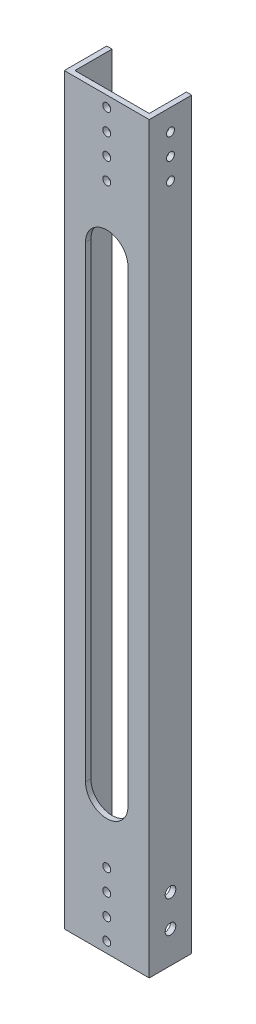
ISO-10303-21;
HEADER;
FILE_DESCRIPTION(('STEP AP214'),'2;1');
FILE_NAME('part.step','',(''),(''),'','','');
FILE_SCHEMA(('AUTOMOTIVE_DESIGN { 1 0 10303 214 1 1 1 1 }'));
ENDSEC;
DATA;
#1=APPLICATION_CONTEXT('core data for automotive mechanical design processes');
#2=APPLICATION_PROTOCOL_DEFINITION('international standard','automotive_design',2000,#1);
#3=PRODUCT_CONTEXT('',#1,'mechanical');
#4=PRODUCT('Part','Part','',(#3));
#5=PRODUCT_RELATED_PRODUCT_CATEGORY('part','',(#4));
#6=PRODUCT_DEFINITION_FORMATION('','',#4);
#7=PRODUCT_DEFINITION_CONTEXT('part definition',#1,'design');
#8=PRODUCT_DEFINITION('design','',#6,#7);
#9=PRODUCT_DEFINITION_SHAPE('','',#8);
#10=(LENGTH_UNIT() NAMED_UNIT(*) SI_UNIT(.MILLI.,.METRE.));
#11=(NAMED_UNIT(*) PLANE_ANGLE_UNIT() SI_UNIT($,.RADIAN.));
#12=(NAMED_UNIT(*) SI_UNIT($,.STERADIAN.) SOLID_ANGLE_UNIT());
#13=UNCERTAINTY_MEASURE_WITH_UNIT(LENGTH_MEASURE(1.E-05),#10,'distance_accuracy_value','');
#14=(GEOMETRIC_REPRESENTATION_CONTEXT(3) GLOBAL_UNCERTAINTY_ASSIGNED_CONTEXT((#13)) GLOBAL_UNIT_ASSIGNED_CONTEXT((#10,
#11,#12)) REPRESENTATION_CONTEXT('',''));
#15=CARTESIAN_POINT('',(0.,0.,0.));
#16=DIRECTION('',(0.,0.,1.));
#17=DIRECTION('',(1.,0.,0.));
#18=AXIS2_PLACEMENT_3D('',#15,#16,#17);
#19=CARTESIAN_POINT('',(0.,444.5,0.));
#20=DIRECTION('',(0.,0.,-1.));
#21=DIRECTION('',(-1.,0.,0.));
#22=AXIS2_PLACEMENT_3D('',#19,#20,#21);
#23=PLANE('',#22);
#24=CARTESIAN_POINT('',(25.4,44.45,0.));
#25=DIRECTION('',(0.,0.,1.));
#26=DIRECTION('',(1.,0.,0.));
#27=AXIS2_PLACEMENT_3D('',#24,#25,#26);
#28=CIRCLE('',#27,2.38124999999999);
#29=CARTESIAN_POINT('',(27.78125,44.45,0.));
#30=VERTEX_POINT('',#29);
#31=EDGE_CURVE('E663',#30,#30,#28,.T.);
#32=ORIENTED_EDGE('',*,*,#31,.F.);
#33=EDGE_LOOP('',(#32));
#34=FACE_BOUND('',#33,.T.);
#35=CARTESIAN_POINT('',(25.4,425.45,0.));
#36=DIRECTION('',(0.,0.,1.));
#37=DIRECTION('',(1.,0.,0.));
#38=AXIS2_PLACEMENT_3D('',#35,#36,#37);
#39=CIRCLE('',#38,2.38125000000002);
#40=CARTESIAN_POINT('',(27.78125,425.45,0.));
#41=VERTEX_POINT('',#40);
#42=EDGE_CURVE('E179',#41,#41,#39,.T.);
#43=ORIENTED_EDGE('',*,*,#42,.F.);
#44=EDGE_LOOP('',(#43));
#45=FACE_BOUND('',#44,.T.);
#46=CARTESIAN_POINT('',(25.4,412.75,0.));
#47=DIRECTION('',(0.,0.,1.));
#48=DIRECTION('',(1.,0.,0.));
#49=AXIS2_PLACEMENT_3D('',#46,#47,#48);
#50=CIRCLE('',#49,2.38125000000002);
#51=CARTESIAN_POINT('',(27.78125,412.75,0.));
#52=VERTEX_POINT('',#51);
#53=EDGE_CURVE('E242',#52,#52,#50,.T.);
#54=ORIENTED_EDGE('',*,*,#53,.F.);
#55=EDGE_LOOP('',(#54));
#56=FACE_BOUND('',#55,.T.);
#57=CARTESIAN_POINT('',(25.4,400.05,0.));
#58=DIRECTION('',(0.,0.,1.));
#59=DIRECTION('',(1.,0.,0.));
#60=AXIS2_PLACEMENT_3D('',#57,#58,#59);
#61=CIRCLE('',#60,2.38125000000002);
#62=CARTESIAN_POINT('',(27.78125,400.05,0.));
#63=VERTEX_POINT('',#62);
#64=EDGE_CURVE('E239',#63,#63,#61,.T.);
#65=ORIENTED_EDGE('',*,*,#64,.F.);
#66=EDGE_LOOP('',(#65));
#67=FACE_BOUND('',#66,.T.);
#68=CARTESIAN_POINT('',(25.4,438.15,0.));
#69=DIRECTION('',(0.,0.,1.));
#70=DIRECTION('',(1.,0.,0.));
#71=AXIS2_PLACEMENT_3D('',#68,#69,#70);
#72=CIRCLE('',#71,2.38125000000002);
#73=CARTESIAN_POINT('',(27.78125,438.15,0.));
#74=VERTEX_POINT('',#73);
#75=EDGE_CURVE('E175',#74,#74,#72,.T.);
#76=ORIENTED_EDGE('',*,*,#75,.F.);
#77=EDGE_LOOP('',(#76));
#78=FACE_BOUND('',#77,.T.);
#79=DIRECTION('',(0.,1.,0.));
#80=VECTOR('',#79,1.);
#81=CARTESIAN_POINT('',(50.8,444.5,0.));
#82=LINE('',#81,#80);
#83=CARTESIAN_POINT('',(50.8,444.5,0.));
#84=VERTEX_POINT('',#83);
#85=CARTESIAN_POINT('',(50.8,0.,0.));
#86=VERTEX_POINT('',#85);
#87=EDGE_CURVE('E49',#84,#86,#82,.F.);
#88=ORIENTED_EDGE('',*,*,#87,.F.);
#89=DIRECTION('',(-1.,0.,0.));
#90=VECTOR('',#89,1.);
#91=CARTESIAN_POINT('',(0.,444.5,0.));
#92=LINE('',#91,#90);
#93=CARTESIAN_POINT('',(0.,444.5,0.));
#94=VERTEX_POINT('',#93);
#95=EDGE_CURVE('E169',#94,#84,#92,.F.);
#96=ORIENTED_EDGE('',*,*,#95,.F.);
#97=DIRECTION('',(0.,1.,0.));
#98=VECTOR('',#97,1.);
#99=CARTESIAN_POINT('',(0.,444.5,0.));
#100=LINE('',#99,#98);
#101=CARTESIAN_POINT('',(0.,0.,0.));
#102=VERTEX_POINT('',#101);
#103=EDGE_CURVE('E172',#102,#94,#100,.T.);
#104=ORIENTED_EDGE('',*,*,#103,.F.);
#105=DIRECTION('',(-1.,0.,0.));
#106=VECTOR('',#105,1.);
#107=CARTESIAN_POINT('',(0.,0.,0.));
#108=LINE('',#107,#106);
#109=EDGE_CURVE('E11',#86,#102,#108,.T.);
#110=ORIENTED_EDGE('',*,*,#109,.F.);
#111=EDGE_LOOP('',(#88,#96,#104,#110));
#112=FACE_BOUND('',#111,.T.);
#113=DIRECTION('',(0.,-1.,0.));
#114=VECTOR('',#113,1.);
#115=CARTESIAN_POINT('',(12.7,361.95,0.));
#116=LINE('',#115,#114);
#117=CARTESIAN_POINT('',(12.7,361.95,0.));
#118=VERTEX_POINT('',#117);
#119=CARTESIAN_POINT('',(12.7,82.55,0.));
#120=VERTEX_POINT('',#119);
#121=EDGE_CURVE('E152',#118,#120,#116,.T.);
#122=ORIENTED_EDGE('',*,*,#121,.F.);
#123=CARTESIAN_POINT('',(25.4,361.95,0.));
#124=DIRECTION('',(0.,0.,1.));
#125=DIRECTION('',(1.,0.,0.));
#126=AXIS2_PLACEMENT_3D('',#123,#124,#125);
#127=CIRCLE('',#126,12.7);
#128=CARTESIAN_POINT('',(38.1,361.95,0.));
#129=VERTEX_POINT('',#128);
#130=EDGE_CURVE('E65',#129,#118,#127,.T.);
#131=ORIENTED_EDGE('',*,*,#130,.F.);
#132=DIRECTION('',(0.,1.,0.));
#133=VECTOR('',#132,1.);
#134=CARTESIAN_POINT('',(38.1,361.95,0.));
#135=LINE('',#134,#133);
#136=CARTESIAN_POINT('',(38.1,82.55,0.));
#137=VERTEX_POINT('',#136);
#138=EDGE_CURVE('E139',#137,#129,#135,.T.);
#139=ORIENTED_EDGE('',*,*,#138,.F.);
#140=CARTESIAN_POINT('',(25.4,82.55,0.));
#141=DIRECTION('',(0.,0.,1.));
#142=DIRECTION('',(1.,0.,0.));
#143=AXIS2_PLACEMENT_3D('',#140,#141,#142);
#144=CIRCLE('',#143,12.7);
#145=EDGE_CURVE('E158',#120,#137,#144,.T.);
#146=ORIENTED_EDGE('',*,*,#145,.F.);
#147=EDGE_LOOP('',(#122,#131,#139,#146));
#148=FACE_BOUND('',#147,.T.);
#149=CARTESIAN_POINT('',(25.4,6.35,0.));
#150=DIRECTION('',(0.,0.,1.));
#151=DIRECTION('',(1.,0.,0.));
#152=AXIS2_PLACEMENT_3D('',#149,#150,#151);
#153=CIRCLE('',#152,2.38124999999999);
#154=CARTESIAN_POINT('',(27.78125,6.35,0.));
#155=VERTEX_POINT('',#154);
#156=EDGE_CURVE('E679',#155,#155,#153,.T.);
#157=ORIENTED_EDGE('',*,*,#156,.F.);
#158=EDGE_LOOP('',(#157));
#159=FACE_BOUND('',#158,.T.);
#160=CARTESIAN_POINT('',(25.4,19.05,0.));
#161=DIRECTION('',(0.,0.,1.));
#162=DIRECTION('',(1.,0.,0.));
#163=AXIS2_PLACEMENT_3D('',#160,#161,#162);
#164=CIRCLE('',#163,2.38124999999999);
#165=CARTESIAN_POINT('',(27.78125,19.05,0.));
#166=VERTEX_POINT('',#165);
#167=EDGE_CURVE('E673',#166,#166,#164,.T.);
#168=ORIENTED_EDGE('',*,*,#167,.F.);
#169=EDGE_LOOP('',(#168));
#170=FACE_BOUND('',#169,.T.);
#171=CARTESIAN_POINT('',(25.4,31.75,0.));
#172=DIRECTION('',(0.,0.,1.));
#173=DIRECTION('',(1.,0.,0.));
#174=AXIS2_PLACEMENT_3D('',#171,#172,#173);
#175=CIRCLE('',#174,2.38124999999999);
#176=CARTESIAN_POINT('',(27.78125,31.75,0.));
#177=VERTEX_POINT('',#176);
#178=EDGE_CURVE('E665',#177,#177,#175,.T.);
#179=ORIENTED_EDGE('',*,*,#178,.F.);
#180=EDGE_LOOP('',(#179));
#181=FACE_BOUND('',#180,.T.);
#182=ADVANCED_FACE('F40',(#34,#45,#56,#67,#78,#112,#148,#159,#170,#181),#23,.F.);
#183=CARTESIAN_POINT('',(0.,431.8,-12.7));
#184=DIRECTION('',(1.,0.,0.));
#185=DIRECTION('',(0.,0.,-1.));
#186=AXIS2_PLACEMENT_3D('',#183,#184,#185);
#187=CYLINDRICAL_SURFACE('',#186,2.38125000000006);
#188=CARTESIAN_POINT('',(0.,431.8,-12.7));
#189=DIRECTION('',(1.,0.,0.));
#190=DIRECTION('',(0.,0.,-1.));
#191=AXIS2_PLACEMENT_3D('',#188,#189,#190);
#192=CIRCLE('',#191,2.38125000000006);
#193=CARTESIAN_POINT('',(0.,431.8,-15.0812500000001));
#194=VERTEX_POINT('',#193);
#195=EDGE_CURVE('E271',#194,#194,#192,.F.);
#196=ORIENTED_EDGE('',*,*,#195,.T.);
#197=EDGE_LOOP('',(#196));
#198=FACE_BOUND('',#197,.T.);
#199=CARTESIAN_POINT('',(3.175,431.8,-12.7));
#200=DIRECTION('',(1.,0.,0.));
#201=DIRECTION('',(0.,0.,-1.));
#202=AXIS2_PLACEMENT_3D('',#199,#200,#201);
#203=CIRCLE('',#202,2.38125000000006);
#204=CARTESIAN_POINT('',(3.175,431.8,-15.0812500000001));
#205=VERTEX_POINT('',#204);
#206=EDGE_CURVE('E232',#205,#205,#203,.T.);
#207=ORIENTED_EDGE('',*,*,#206,.T.);
#208=EDGE_LOOP('',(#207));
#209=FACE_BOUND('',#208,.T.);
#210=ADVANCED_FACE('F42',(#198,#209),#187,.F.);
#211=CARTESIAN_POINT('',(0.,406.4,-12.7));
#212=DIRECTION('',(1.,0.,0.));
#213=DIRECTION('',(0.,0.,-1.));
#214=AXIS2_PLACEMENT_3D('',#211,#212,#213);
#215=CYLINDRICAL_SURFACE('',#214,2.38125000000006);
#216=CARTESIAN_POINT('',(0.,406.4,-12.7));
#217=DIRECTION('',(1.,0.,0.));
#218=DIRECTION('',(0.,0.,-1.));
#219=AXIS2_PLACEMENT_3D('',#216,#217,#218);
#220=CIRCLE('',#219,2.38125000000006);
#221=CARTESIAN_POINT('',(0.,406.4,-15.0812500000001));
#222=VERTEX_POINT('',#221);
#223=EDGE_CURVE('E268',#222,#222,#220,.F.);
#224=ORIENTED_EDGE('',*,*,#223,.T.);
#225=EDGE_LOOP('',(#224));
#226=FACE_BOUND('',#225,.T.);
#227=CARTESIAN_POINT('',(3.175,406.4,-12.7));
#228=DIRECTION('',(1.,0.,0.));
#229=DIRECTION('',(0.,0.,-1.));
#230=AXIS2_PLACEMENT_3D('',#227,#228,#229);
#231=CIRCLE('',#230,2.38125000000006);
#232=CARTESIAN_POINT('',(3.175,406.4,-15.0812500000001));
#233=VERTEX_POINT('',#232);
#234=EDGE_CURVE('E293',#233,#233,#231,.T.);
#235=ORIENTED_EDGE('',*,*,#234,.T.);
#236=EDGE_LOOP('',(#235));
#237=FACE_BOUND('',#236,.T.);
#238=ADVANCED_FACE('F338',(#226,#237),#215,.F.);
#239=CARTESIAN_POINT('',(0.,419.1,-12.7));
#240=DIRECTION('',(1.,0.,0.));
#241=DIRECTION('',(0.,0.,-1.));
#242=AXIS2_PLACEMENT_3D('',#239,#240,#241);
#243=CYLINDRICAL_SURFACE('',#242,2.38125000000006);
#244=CARTESIAN_POINT('',(0.,419.1,-12.7));
#245=DIRECTION('',(1.,0.,0.));
#246=DIRECTION('',(0.,0.,-1.));
#247=AXIS2_PLACEMENT_3D('',#244,#245,#246);
#248=CIRCLE('',#247,2.38125000000006);
#249=CARTESIAN_POINT('',(0.,419.1,-15.0812500000001));
#250=VERTEX_POINT('',#249);
#251=EDGE_CURVE('E265',#250,#250,#248,.F.);
#252=ORIENTED_EDGE('',*,*,#251,.T.);
#253=EDGE_LOOP('',(#252));
#254=FACE_BOUND('',#253,.T.);
#255=CARTESIAN_POINT('',(3.175,419.1,-12.7));
#256=DIRECTION('',(1.,0.,0.));
#257=DIRECTION('',(0.,0.,-1.));
#258=AXIS2_PLACEMENT_3D('',#255,#256,#257);
#259=CIRCLE('',#258,2.38125000000006);
#260=CARTESIAN_POINT('',(3.175,419.1,-15.0812500000001));
#261=VERTEX_POINT('',#260);
#262=EDGE_CURVE('E290',#261,#261,#259,.T.);
#263=ORIENTED_EDGE('',*,*,#262,.T.);
#264=EDGE_LOOP('',(#263));
#265=FACE_BOUND('',#264,.T.);
#266=ADVANCED_FACE('F403',(#254,#265),#243,.F.);
#267=CARTESIAN_POINT('',(0.,19.05,-12.7));
#268=DIRECTION('',(1.,0.,0.));
#269=DIRECTION('',(0.,0.,-1.));
#270=AXIS2_PLACEMENT_3D('',#267,#268,#269);
#271=CYLINDRICAL_SURFACE('',#270,3.17500000000001);
#272=CARTESIAN_POINT('',(0.,19.05,-12.7));
#273=DIRECTION('',(1.,0.,0.));
#274=DIRECTION('',(0.,0.,-1.));
#275=AXIS2_PLACEMENT_3D('',#272,#273,#274);
#276=CIRCLE('',#275,3.17500000000001);
#277=CARTESIAN_POINT('',(0.,19.05,-15.875));
#278=VERTEX_POINT('',#277);
#279=EDGE_CURVE('E262',#278,#278,#276,.F.);
#280=ORIENTED_EDGE('',*,*,#279,.T.);
#281=EDGE_LOOP('',(#280));
#282=FACE_BOUND('',#281,.T.);
#283=CARTESIAN_POINT('',(3.175,19.05,-12.7));
#284=DIRECTION('',(1.,0.,0.));
#285=DIRECTION('',(0.,0.,-1.));
#286=AXIS2_PLACEMENT_3D('',#283,#284,#285);
#287=CIRCLE('',#286,3.17500000000001);
#288=CARTESIAN_POINT('',(3.175,19.05,-15.875));
#289=VERTEX_POINT('',#288);
#290=EDGE_CURVE('E287',#289,#289,#287,.T.);
#291=ORIENTED_EDGE('',*,*,#290,.T.);
#292=EDGE_LOOP('',(#291));
#293=FACE_BOUND('',#292,.T.);
#294=ADVANCED_FACE('F408',(#282,#293),#271,.F.);
#295=CARTESIAN_POINT('',(0.,38.1,-12.7));
#296=DIRECTION('',(1.,0.,0.));
#297=DIRECTION('',(0.,0.,-1.));
#298=AXIS2_PLACEMENT_3D('',#295,#296,#297);
#299=CYLINDRICAL_SURFACE('',#298,3.175);
#300=CARTESIAN_POINT('',(0.,38.1,-12.7));
#301=DIRECTION('',(1.,0.,0.));
#302=DIRECTION('',(0.,0.,-1.));
#303=AXIS2_PLACEMENT_3D('',#300,#301,#302);
#304=CIRCLE('',#303,3.175);
#305=CARTESIAN_POINT('',(0.,38.1,-15.875));
#306=VERTEX_POINT('',#305);
#307=EDGE_CURVE('E220',#306,#306,#304,.F.);
#308=ORIENTED_EDGE('',*,*,#307,.T.);
#309=EDGE_LOOP('',(#308));
#310=FACE_BOUND('',#309,.T.);
#311=CARTESIAN_POINT('',(3.175,38.1,-12.7));
#312=DIRECTION('',(1.,0.,0.));
#313=DIRECTION('',(0.,0.,-1.));
#314=AXIS2_PLACEMENT_3D('',#311,#312,#313);
#315=CIRCLE('',#314,3.175);
#316=CARTESIAN_POINT('',(3.175,38.1,-15.875));
#317=VERTEX_POINT('',#316);
#318=EDGE_CURVE('E228',#317,#317,#315,.T.);
#319=ORIENTED_EDGE('',*,*,#318,.T.);
#320=EDGE_LOOP('',(#319));
#321=FACE_BOUND('',#320,.T.);
#322=ADVANCED_FACE('F414',(#310,#321),#299,.F.);
#323=CARTESIAN_POINT('',(0.,431.8,-12.7));
#324=DIRECTION('',(1.,0.,0.));
#325=DIRECTION('',(0.,0.,-1.));
#326=AXIS2_PLACEMENT_3D('',#323,#324,#325);
#327=CYLINDRICAL_SURFACE('',#326,2.38125000000006);
#328=CARTESIAN_POINT('',(47.625,431.8,-12.7));
#329=DIRECTION('',(1.,0.,0.));
#330=DIRECTION('',(0.,0.,-1.));
#331=AXIS2_PLACEMENT_3D('',#328,#329,#330);
#332=CIRCLE('',#331,2.38125000000006);
#333=CARTESIAN_POINT('',(47.625,431.8,-15.0812500000001));
#334=VERTEX_POINT('',#333);
#335=EDGE_CURVE('E44',#334,#334,#332,.F.);
#336=ORIENTED_EDGE('',*,*,#335,.T.);
#337=EDGE_LOOP('',(#336));
#338=FACE_BOUND('',#337,.T.);
#339=CARTESIAN_POINT('',(50.8,431.8,-12.7));
#340=DIRECTION('',(1.,0.,0.));
#341=DIRECTION('',(0.,0.,-1.));
#342=AXIS2_PLACEMENT_3D('',#339,#340,#341);
#343=CIRCLE('',#342,2.38125000000006);
#344=CARTESIAN_POINT('',(50.8,431.8,-15.0812500000001));
#345=VERTEX_POINT('',#344);
#346=EDGE_CURVE('E207',#345,#345,#343,.T.);
#347=ORIENTED_EDGE('',*,*,#346,.T.);
#348=EDGE_LOOP('',(#347));
#349=FACE_BOUND('',#348,.T.);
#350=ADVANCED_FACE('F312',(#338,#349),#327,.F.);
#351=CARTESIAN_POINT('',(0.,406.4,-12.7));
#352=DIRECTION('',(1.,0.,0.));
#353=DIRECTION('',(0.,0.,-1.));
#354=AXIS2_PLACEMENT_3D('',#351,#352,#353);
#355=CYLINDRICAL_SURFACE('',#354,2.38125000000006);
#356=CARTESIAN_POINT('',(47.625,406.4,-12.7));
#357=DIRECTION('',(1.,0.,0.));
#358=DIRECTION('',(0.,0.,-1.));
#359=AXIS2_PLACEMENT_3D('',#356,#357,#358);
#360=CIRCLE('',#359,2.38125000000006);
#361=CARTESIAN_POINT('',(47.625,406.4,-15.0812500000001));
#362=VERTEX_POINT('',#361);
#363=EDGE_CURVE('E305',#362,#362,#360,.F.);
#364=ORIENTED_EDGE('',*,*,#363,.T.);
#365=EDGE_LOOP('',(#364));
#366=FACE_BOUND('',#365,.T.);
#367=CARTESIAN_POINT('',(50.8,406.4,-12.7));
#368=DIRECTION('',(1.,0.,0.));
#369=DIRECTION('',(0.,0.,-1.));
#370=AXIS2_PLACEMENT_3D('',#367,#368,#369);
#371=CIRCLE('',#370,2.38125000000006);
#372=CARTESIAN_POINT('',(50.8,406.4,-15.0812500000001));
#373=VERTEX_POINT('',#372);
#374=EDGE_CURVE('E255',#373,#373,#371,.T.);
#375=ORIENTED_EDGE('',*,*,#374,.T.);
#376=EDGE_LOOP('',(#375));
#377=FACE_BOUND('',#376,.T.);
#378=ADVANCED_FACE('F421',(#366,#377),#355,.F.);
#379=CARTESIAN_POINT('',(0.,419.1,-12.7));
#380=DIRECTION('',(1.,0.,0.));
#381=DIRECTION('',(0.,0.,-1.));
#382=AXIS2_PLACEMENT_3D('',#379,#380,#381);
#383=CYLINDRICAL_SURFACE('',#382,2.38125000000006);
#384=CARTESIAN_POINT('',(47.625,419.1,-12.7));
#385=DIRECTION('',(1.,0.,0.));
#386=DIRECTION('',(0.,0.,-1.));
#387=AXIS2_PLACEMENT_3D('',#384,#385,#386);
#388=CIRCLE('',#387,2.38125000000006);
#389=CARTESIAN_POINT('',(47.625,419.1,-15.0812500000001));
#390=VERTEX_POINT('',#389);
#391=EDGE_CURVE('E303',#390,#390,#388,.F.);
#392=ORIENTED_EDGE('',*,*,#391,.T.);
#393=EDGE_LOOP('',(#392));
#394=FACE_BOUND('',#393,.T.);
#395=CARTESIAN_POINT('',(50.8,419.1,-12.7));
#396=DIRECTION('',(1.,0.,0.));
#397=DIRECTION('',(0.,0.,-1.));
#398=AXIS2_PLACEMENT_3D('',#395,#396,#397);
#399=CIRCLE('',#398,2.38125000000006);
#400=CARTESIAN_POINT('',(50.8,419.1,-15.0812500000001));
#401=VERTEX_POINT('',#400);
#402=EDGE_CURVE('E252',#401,#401,#399,.T.);
#403=ORIENTED_EDGE('',*,*,#402,.T.);
#404=EDGE_LOOP('',(#403));
#405=FACE_BOUND('',#404,.T.);
#406=ADVANCED_FACE('F424',(#394,#405),#383,.F.);
#407=CARTESIAN_POINT('',(0.,19.05,-12.7));
#408=DIRECTION('',(1.,0.,0.));
#409=DIRECTION('',(0.,0.,-1.));
#410=AXIS2_PLACEMENT_3D('',#407,#408,#409);
#411=CYLINDRICAL_SURFACE('',#410,3.17500000000001);
#412=CARTESIAN_POINT('',(47.625,19.05,-12.7));
#413=DIRECTION('',(1.,0.,0.));
#414=DIRECTION('',(0.,0.,-1.));
#415=AXIS2_PLACEMENT_3D('',#412,#413,#414);
#416=CIRCLE('',#415,3.17500000000001);
#417=CARTESIAN_POINT('',(47.625,19.05,-15.875));
#418=VERTEX_POINT('',#417);
#419=EDGE_CURVE('E300',#418,#418,#416,.F.);
#420=ORIENTED_EDGE('',*,*,#419,.T.);
#421=EDGE_LOOP('',(#420));
#422=FACE_BOUND('',#421,.T.);
#423=CARTESIAN_POINT('',(50.8,19.05,-12.7));
#424=DIRECTION('',(1.,0.,0.));
#425=DIRECTION('',(0.,0.,-1.));
#426=AXIS2_PLACEMENT_3D('',#423,#424,#425);
#427=CIRCLE('',#426,3.17500000000001);
#428=CARTESIAN_POINT('',(50.8,19.05,-15.875));
#429=VERTEX_POINT('',#428);
#430=EDGE_CURVE('E249',#429,#429,#427,.T.);
#431=ORIENTED_EDGE('',*,*,#430,.T.);
#432=EDGE_LOOP('',(#431));
#433=FACE_BOUND('',#432,.T.);
#434=ADVANCED_FACE('F427',(#422,#433),#411,.F.);
#435=CARTESIAN_POINT('',(0.,38.1,-12.7));
#436=DIRECTION('',(1.,0.,0.));
#437=DIRECTION('',(0.,0.,-1.));
#438=AXIS2_PLACEMENT_3D('',#435,#436,#437);
#439=CYLINDRICAL_SURFACE('',#438,3.175);
#440=CARTESIAN_POINT('',(47.625,38.1,-12.7));
#441=DIRECTION('',(1.,0.,0.));
#442=DIRECTION('',(0.,0.,-1.));
#443=AXIS2_PLACEMENT_3D('',#440,#441,#442);
#444=CIRCLE('',#443,3.175);
#445=CARTESIAN_POINT('',(47.625,38.1,-15.875));
#446=VERTEX_POINT('',#445);
#447=EDGE_CURVE('E236',#446,#446,#444,.F.);
#448=ORIENTED_EDGE('',*,*,#447,.T.);
#449=EDGE_LOOP('',(#448));
#450=FACE_BOUND('',#449,.T.);
#451=CARTESIAN_POINT('',(50.8,38.1,-12.7));
#452=DIRECTION('',(1.,0.,0.));
#453=DIRECTION('',(0.,0.,-1.));
#454=AXIS2_PLACEMENT_3D('',#451,#452,#453);
#455=CIRCLE('',#454,3.175);
#456=CARTESIAN_POINT('',(50.8,38.1,-15.875));
#457=VERTEX_POINT('',#456);
#458=EDGE_CURVE('E203',#457,#457,#455,.T.);
#459=ORIENTED_EDGE('',*,*,#458,.T.);
#460=EDGE_LOOP('',(#459));
#461=FACE_BOUND('',#460,.T.);
#462=ADVANCED_FACE('F327',(#450,#461),#439,.F.);
#463=CARTESIAN_POINT('',(50.8,444.5,-25.4));
#464=DIRECTION('',(0.,0.,1.));
#465=DIRECTION('',(1.,0.,0.));
#466=AXIS2_PLACEMENT_3D('',#463,#464,#465);
#467=PLANE('',#466);
#468=DIRECTION('',(0.,1.,0.));
#469=VECTOR('',#468,1.);
#470=CARTESIAN_POINT('',(47.625,444.5,-25.4));
#471=LINE('',#470,#469);
#472=CARTESIAN_POINT('',(47.625,0.,-25.4));
#473=VERTEX_POINT('',#472);
#474=CARTESIAN_POINT('',(47.625,444.5,-25.4));
#475=VERTEX_POINT('',#474);
#476=EDGE_CURVE('E233',#473,#475,#471,.T.);
#477=ORIENTED_EDGE('',*,*,#476,.T.);
#478=DIRECTION('',(1.,0.,0.));
#479=VECTOR('',#478,1.);
#480=CARTESIAN_POINT('',(0.,444.5,-25.4));
#481=LINE('',#480,#479);
#482=CARTESIAN_POINT('',(50.8,444.5,-25.4));
#483=VERTEX_POINT('',#482);
#484=EDGE_CURVE('E214',#483,#475,#481,.F.);
#485=ORIENTED_EDGE('',*,*,#484,.F.);
#486=DIRECTION('',(0.,1.,0.));
#487=VECTOR('',#486,1.);
#488=CARTESIAN_POINT('',(50.8,444.5,-25.4));
#489=LINE('',#488,#487);
#490=CARTESIAN_POINT('',(50.8,0.,-25.4));
#491=VERTEX_POINT('',#490);
#492=EDGE_CURVE('E198',#483,#491,#489,.F.);
#493=ORIENTED_EDGE('',*,*,#492,.T.);
#494=DIRECTION('',(1.,0.,0.));
#495=VECTOR('',#494,1.);
#496=CARTESIAN_POINT('',(0.,0.,-25.4));
#497=LINE('',#496,#495);
#498=EDGE_CURVE('E192',#491,#473,#497,.F.);
#499=ORIENTED_EDGE('',*,*,#498,.T.);
#500=EDGE_LOOP('',(#477,#485,#493,#499));
#501=FACE_BOUND('',#500,.T.);
#502=ADVANCED_FACE('F317',(#501),#467,.F.);
#503=CARTESIAN_POINT('',(47.625,444.5,-25.4));
#504=DIRECTION('',(1.,0.,0.));
#505=DIRECTION('',(0.,0.,-1.));
#506=AXIS2_PLACEMENT_3D('',#503,#504,#505);
#507=PLANE('',#506);
#508=DIRECTION('',(0.,1.,0.));
#509=VECTOR('',#508,1.);
#510=CARTESIAN_POINT('',(47.625,444.5,-3.175));
#511=LINE('',#510,#509);
#512=CARTESIAN_POINT('',(47.625,0.,-3.175));
#513=VERTEX_POINT('',#512);
#514=CARTESIAN_POINT('',(47.625,444.5,-3.175));
#515=VERTEX_POINT('',#514);
#516=EDGE_CURVE('E229',#513,#515,#511,.T.);
#517=ORIENTED_EDGE('',*,*,#516,.T.);
#518=DIRECTION('',(0.,0.,1.));
#519=VECTOR('',#518,1.);
#520=CARTESIAN_POINT('',(47.625,444.5,0.));
#521=LINE('',#520,#519);
#522=EDGE_CURVE('E212',#475,#515,#521,.T.);
#523=ORIENTED_EDGE('',*,*,#522,.F.);
#524=ORIENTED_EDGE('',*,*,#476,.F.);
#525=DIRECTION('',(0.,0.,1.));
#526=VECTOR('',#525,1.);
#527=CARTESIAN_POINT('',(47.625,0.,0.));
#528=LINE('',#527,#526);
#529=EDGE_CURVE('E189',#473,#513,#528,.T.);
#530=ORIENTED_EDGE('',*,*,#529,.T.);
#531=EDGE_LOOP('',(#517,#523,#524,#530));
#532=FACE_BOUND('',#531,.T.);
#533=ORIENTED_EDGE('',*,*,#447,.F.);
#534=EDGE_LOOP('',(#533));
#535=FACE_BOUND('',#534,.T.);
#536=ORIENTED_EDGE('',*,*,#419,.F.);
#537=EDGE_LOOP('',(#536));
#538=FACE_BOUND('',#537,.T.);
#539=ORIENTED_EDGE('',*,*,#391,.F.);
#540=EDGE_LOOP('',(#539));
#541=FACE_BOUND('',#540,.T.);
#542=ORIENTED_EDGE('',*,*,#363,.F.);
#543=EDGE_LOOP('',(#542));
#544=FACE_BOUND('',#543,.T.);
#545=ORIENTED_EDGE('',*,*,#335,.F.);
#546=EDGE_LOOP('',(#545));
#547=FACE_BOUND('',#546,.T.);
#548=ADVANCED_FACE('F315',(#532,#535,#538,#541,#544,#547),#507,.F.);
#549=CARTESIAN_POINT('',(47.625,444.5,-3.175));
#550=DIRECTION('',(0.,0.,1.));
#551=DIRECTION('',(1.,0.,0.));
#552=AXIS2_PLACEMENT_3D('',#549,#550,#551);
#553=PLANE('',#552);
#554=CARTESIAN_POINT('',(25.4,44.45,-3.175));
#555=DIRECTION('',(0.,0.,1.));
#556=DIRECTION('',(1.,0.,0.));
#557=AXIS2_PLACEMENT_3D('',#554,#555,#556);
#558=CIRCLE('',#557,2.38124999999999);
#559=CARTESIAN_POINT('',(27.78125,44.45,-3.175));
#560=VERTEX_POINT('',#559);
#561=EDGE_CURVE('E661',#560,#560,#558,.T.);
#562=ORIENTED_EDGE('',*,*,#561,.T.);
#563=EDGE_LOOP('',(#562));
#564=FACE_BOUND('',#563,.T.);
#565=CARTESIAN_POINT('',(25.4,31.75,-3.175));
#566=DIRECTION('',(0.,0.,1.));
#567=DIRECTION('',(1.,0.,0.));
#568=AXIS2_PLACEMENT_3D('',#565,#566,#567);
#569=CIRCLE('',#568,2.38124999999999);
#570=CARTESIAN_POINT('',(27.78125,31.75,-3.175));
#571=VERTEX_POINT('',#570);
#572=EDGE_CURVE('E670',#571,#571,#569,.T.);
#573=ORIENTED_EDGE('',*,*,#572,.T.);
#574=EDGE_LOOP('',(#573));
#575=FACE_BOUND('',#574,.T.);
#576=CARTESIAN_POINT('',(25.4,19.05,-3.175));
#577=DIRECTION('',(0.,0.,1.));
#578=DIRECTION('',(1.,0.,0.));
#579=AXIS2_PLACEMENT_3D('',#576,#577,#578);
#580=CIRCLE('',#579,2.38124999999999);
#581=CARTESIAN_POINT('',(27.78125,19.05,-3.175));
#582=VERTEX_POINT('',#581);
#583=EDGE_CURVE('E676',#582,#582,#580,.T.);
#584=ORIENTED_EDGE('',*,*,#583,.T.);
#585=EDGE_LOOP('',(#584));
#586=FACE_BOUND('',#585,.T.);
#587=CARTESIAN_POINT('',(25.4,6.35,-3.175));
#588=DIRECTION('',(0.,0.,1.));
#589=DIRECTION('',(1.,0.,0.));
#590=AXIS2_PLACEMENT_3D('',#587,#588,#589);
#591=CIRCLE('',#590,2.38124999999999);
#592=CARTESIAN_POINT('',(27.78125,6.35,-3.175));
#593=VERTEX_POINT('',#592);
#594=EDGE_CURVE('E682',#593,#593,#591,.T.);
#595=ORIENTED_EDGE('',*,*,#594,.T.);
#596=EDGE_LOOP('',(#595));
#597=FACE_BOUND('',#596,.T.);
#598=DIRECTION('',(0.,-1.,0.));
#599=VECTOR('',#598,1.);
#600=CARTESIAN_POINT('',(38.1,361.95,-3.175));
#601=LINE('',#600,#599);
#602=CARTESIAN_POINT('',(38.1,361.95,-3.17500000000001));
#603=VERTEX_POINT('',#602);
#604=CARTESIAN_POINT('',(38.1,82.55,-3.175));
#605=VERTEX_POINT('',#604);
#606=EDGE_CURVE('E150',#603,#605,#601,.T.);
#607=ORIENTED_EDGE('',*,*,#606,.F.);
#608=CARTESIAN_POINT('',(25.4,361.95,-3.175));
#609=DIRECTION('',(0.,0.,1.));
#610=DIRECTION('',(1.,0.,0.));
#611=AXIS2_PLACEMENT_3D('',#608,#609,#610);
#612=CIRCLE('',#611,12.7);
#613=CARTESIAN_POINT('',(12.7,361.95,-3.175));
#614=VERTEX_POINT('',#613);
#615=EDGE_CURVE('E133',#614,#603,#612,.F.);
#616=ORIENTED_EDGE('',*,*,#615,.F.);
#617=DIRECTION('',(0.,1.,0.));
#618=VECTOR('',#617,1.);
#619=CARTESIAN_POINT('',(12.7,361.95,-3.175));
#620=LINE('',#619,#618);
#621=CARTESIAN_POINT('',(12.7,82.55,-3.175));
#622=VERTEX_POINT('',#621);
#623=EDGE_CURVE('E142',#622,#614,#620,.T.);
#624=ORIENTED_EDGE('',*,*,#623,.F.);
#625=CARTESIAN_POINT('',(25.4,82.55,-3.175));
#626=DIRECTION('',(0.,0.,1.));
#627=DIRECTION('',(1.,0.,0.));
#628=AXIS2_PLACEMENT_3D('',#625,#626,#627);
#629=CIRCLE('',#628,12.7);
#630=EDGE_CURVE('E57',#605,#622,#629,.F.);
#631=ORIENTED_EDGE('',*,*,#630,.F.);
#632=EDGE_LOOP('',(#607,#616,#624,#631));
#633=FACE_BOUND('',#632,.T.);
#634=DIRECTION('',(0.,1.,0.));
#635=VECTOR('',#634,1.);
#636=CARTESIAN_POINT('',(3.175,444.5,-3.17499999999999));
#637=LINE('',#636,#635);
#638=CARTESIAN_POINT('',(3.175,0.,-3.175));
#639=VERTEX_POINT('',#638);
#640=CARTESIAN_POINT('',(3.175,444.5,-3.175));
#641=VERTEX_POINT('',#640);
#642=EDGE_CURVE('E225',#639,#641,#637,.T.);
#643=ORIENTED_EDGE('',*,*,#642,.T.);
#644=DIRECTION('',(1.,0.,0.));
#645=VECTOR('',#644,1.);
#646=CARTESIAN_POINT('',(0.,444.5,-3.175));
#647=LINE('',#646,#645);
#648=EDGE_CURVE('E210',#515,#641,#647,.F.);
#649=ORIENTED_EDGE('',*,*,#648,.F.);
#650=ORIENTED_EDGE('',*,*,#516,.F.);
#651=DIRECTION('',(1.,0.,0.));
#652=VECTOR('',#651,1.);
#653=CARTESIAN_POINT('',(0.,0.,-3.175));
#654=LINE('',#653,#652);
#655=EDGE_CURVE('E186',#513,#639,#654,.F.);
#656=ORIENTED_EDGE('',*,*,#655,.T.);
#657=EDGE_LOOP('',(#643,#649,#650,#656));
#658=FACE_BOUND('',#657,.T.);
#659=CARTESIAN_POINT('',(25.4,438.15,-3.175));
#660=DIRECTION('',(0.,0.,1.));
#661=DIRECTION('',(1.,0.,0.));
#662=AXIS2_PLACEMENT_3D('',#659,#660,#661);
#663=CIRCLE('',#662,2.38125000000002);
#664=CARTESIAN_POINT('',(27.78125,438.15,-3.175));
#665=VERTEX_POINT('',#664);
#666=EDGE_CURVE('E274',#665,#665,#663,.T.);
#667=ORIENTED_EDGE('',*,*,#666,.T.);
#668=EDGE_LOOP('',(#667));
#669=FACE_BOUND('',#668,.T.);
#670=CARTESIAN_POINT('',(25.4,400.05,-3.175));
#671=DIRECTION('',(0.,0.,1.));
#672=DIRECTION('',(1.,0.,0.));
#673=AXIS2_PLACEMENT_3D('',#670,#671,#672);
#674=CIRCLE('',#673,2.38125000000002);
#675=CARTESIAN_POINT('',(27.78125,400.05,-3.175));
#676=VERTEX_POINT('',#675);
#677=EDGE_CURVE('E277',#676,#676,#674,.T.);
#678=ORIENTED_EDGE('',*,*,#677,.T.);
#679=EDGE_LOOP('',(#678));
#680=FACE_BOUND('',#679,.T.);
#681=CARTESIAN_POINT('',(25.4,412.75,-3.175));
#682=DIRECTION('',(0.,0.,1.));
#683=DIRECTION('',(1.,0.,0.));
#684=AXIS2_PLACEMENT_3D('',#681,#682,#683);
#685=CIRCLE('',#684,2.38125000000002);
#686=CARTESIAN_POINT('',(27.78125,412.75,-3.175));
#687=VERTEX_POINT('',#686);
#688=EDGE_CURVE('E280',#687,#687,#685,.T.);
#689=ORIENTED_EDGE('',*,*,#688,.T.);
#690=EDGE_LOOP('',(#689));
#691=FACE_BOUND('',#690,.T.);
#692=CARTESIAN_POINT('',(25.4,425.45,-3.175));
#693=DIRECTION('',(0.,0.,1.));
#694=DIRECTION('',(1.,0.,0.));
#695=AXIS2_PLACEMENT_3D('',#692,#693,#694);
#696=CIRCLE('',#695,2.38125000000002);
#697=CARTESIAN_POINT('',(27.78125,425.45,-3.175));
#698=VERTEX_POINT('',#697);
#699=EDGE_CURVE('E224',#698,#698,#696,.T.);
#700=ORIENTED_EDGE('',*,*,#699,.T.);
#701=EDGE_LOOP('',(#700));
#702=FACE_BOUND('',#701,.T.);
#703=ADVANCED_FACE('F147',(#564,#575,#586,#597,#633,#658,#669,#680,#691,#702),#553,.F.);
#704=CARTESIAN_POINT('',(3.175,444.5,-3.17499999999999));
#705=DIRECTION('',(-1.,0.,0.));
#706=DIRECTION('',(0.,0.,1.));
#707=AXIS2_PLACEMENT_3D('',#704,#705,#706);
#708=PLANE('',#707);
#709=DIRECTION('',(0.,1.,0.));
#710=VECTOR('',#709,1.);
#711=CARTESIAN_POINT('',(3.175,444.5,-25.4));
#712=LINE('',#711,#710);
#713=CARTESIAN_POINT('',(3.175,0.,-25.4));
#714=VERTEX_POINT('',#713);
#715=CARTESIAN_POINT('',(3.175,444.5,-25.4));
#716=VERTEX_POINT('',#715);
#717=EDGE_CURVE('E221',#714,#716,#712,.T.);
#718=ORIENTED_EDGE('',*,*,#717,.T.);
#719=DIRECTION('',(0.,0.,1.));
#720=VECTOR('',#719,1.);
#721=CARTESIAN_POINT('',(3.175,444.5,0.));
#722=LINE('',#721,#720);
#723=EDGE_CURVE('E208',#641,#716,#722,.F.);
#724=ORIENTED_EDGE('',*,*,#723,.F.);
#725=ORIENTED_EDGE('',*,*,#642,.F.);
#726=DIRECTION('',(0.,0.,1.));
#727=VECTOR('',#726,1.);
#728=CARTESIAN_POINT('',(3.175,0.,0.));
#729=LINE('',#728,#727);
#730=EDGE_CURVE('E183',#639,#714,#729,.F.);
#731=ORIENTED_EDGE('',*,*,#730,.T.);
#732=EDGE_LOOP('',(#718,#724,#725,#731));
#733=FACE_BOUND('',#732,.T.);
#734=ORIENTED_EDGE('',*,*,#318,.F.);
#735=EDGE_LOOP('',(#734));
#736=FACE_BOUND('',#735,.T.);
#737=ORIENTED_EDGE('',*,*,#290,.F.);
#738=EDGE_LOOP('',(#737));
#739=FACE_BOUND('',#738,.T.);
#740=ORIENTED_EDGE('',*,*,#262,.F.);
#741=EDGE_LOOP('',(#740));
#742=FACE_BOUND('',#741,.T.);
#743=ORIENTED_EDGE('',*,*,#234,.F.);
#744=EDGE_LOOP('',(#743));
#745=FACE_BOUND('',#744,.T.);
#746=ORIENTED_EDGE('',*,*,#206,.F.);
#747=EDGE_LOOP('',(#746));
#748=FACE_BOUND('',#747,.T.);
#749=ADVANCED_FACE('F324',(#733,#736,#739,#742,#745,#748),#708,.F.);
#750=CARTESIAN_POINT('',(3.175,444.5,-25.4));
#751=DIRECTION('',(0.,0.,1.));
#752=DIRECTION('',(1.,0.,0.));
#753=AXIS2_PLACEMENT_3D('',#750,#751,#752);
#754=PLANE('',#753);
#755=DIRECTION('',(0.,1.,0.));
#756=VECTOR('',#755,1.);
#757=CARTESIAN_POINT('',(0.,444.5,-25.4));
#758=LINE('',#757,#756);
#759=CARTESIAN_POINT('',(0.,0.,-25.4));
#760=VERTEX_POINT('',#759);
#761=CARTESIAN_POINT('',(0.,444.5,-25.4));
#762=VERTEX_POINT('',#761);
#763=EDGE_CURVE('E218',#760,#762,#758,.T.);
#764=ORIENTED_EDGE('',*,*,#763,.T.);
#765=DIRECTION('',(1.,0.,0.));
#766=VECTOR('',#765,1.);
#767=CARTESIAN_POINT('',(0.,444.5,-25.4));
#768=LINE('',#767,#766);
#769=EDGE_CURVE('E204',#716,#762,#768,.F.);
#770=ORIENTED_EDGE('',*,*,#769,.F.);
#771=ORIENTED_EDGE('',*,*,#717,.F.);
#772=DIRECTION('',(1.,0.,0.));
#773=VECTOR('',#772,1.);
#774=CARTESIAN_POINT('',(0.,0.,-25.4));
#775=LINE('',#774,#773);
#776=EDGE_CURVE('E180',#714,#760,#775,.F.);
#777=ORIENTED_EDGE('',*,*,#776,.T.);
#778=EDGE_LOOP('',(#764,#770,#771,#777));
#779=FACE_BOUND('',#778,.T.);
#780=ADVANCED_FACE('F379',(#779),#754,.F.);
#781=CARTESIAN_POINT('',(25.4,425.45,-25.4));
#782=DIRECTION('',(0.,0.,1.));
#783=DIRECTION('',(1.,0.,0.));
#784=AXIS2_PLACEMENT_3D('',#781,#782,#783);
#785=CYLINDRICAL_SURFACE('',#784,2.38125000000002);
#786=ORIENTED_EDGE('',*,*,#699,.F.);
#787=EDGE_LOOP('',(#786));
#788=FACE_BOUND('',#787,.T.);
#789=ORIENTED_EDGE('',*,*,#42,.T.);
#790=EDGE_LOOP('',(#789));
#791=FACE_BOUND('',#790,.T.);
#792=ADVANCED_FACE('F375',(#788,#791),#785,.F.);
#793=CARTESIAN_POINT('',(25.4,412.75,-25.4));
#794=DIRECTION('',(0.,0.,1.));
#795=DIRECTION('',(1.,0.,0.));
#796=AXIS2_PLACEMENT_3D('',#793,#794,#795);
#797=CYLINDRICAL_SURFACE('',#796,2.38125000000002);
#798=ORIENTED_EDGE('',*,*,#688,.F.);
#799=EDGE_LOOP('',(#798));
#800=FACE_BOUND('',#799,.T.);
#801=ORIENTED_EDGE('',*,*,#53,.T.);
#802=EDGE_LOOP('',(#801));
#803=FACE_BOUND('',#802,.T.);
#804=ADVANCED_FACE('F371',(#800,#803),#797,.F.);
#805=CARTESIAN_POINT('',(25.4,400.05,-25.4));
#806=DIRECTION('',(0.,0.,1.));
#807=DIRECTION('',(1.,0.,0.));
#808=AXIS2_PLACEMENT_3D('',#805,#806,#807);
#809=CYLINDRICAL_SURFACE('',#808,2.38125000000002);
#810=ORIENTED_EDGE('',*,*,#677,.F.);
#811=EDGE_LOOP('',(#810));
#812=FACE_BOUND('',#811,.T.);
#813=ORIENTED_EDGE('',*,*,#64,.T.);
#814=EDGE_LOOP('',(#813));
#815=FACE_BOUND('',#814,.T.);
#816=ADVANCED_FACE('F367',(#812,#815),#809,.F.);
#817=CARTESIAN_POINT('',(25.4,438.15,-25.4));
#818=DIRECTION('',(0.,0.,1.));
#819=DIRECTION('',(1.,0.,0.));
#820=AXIS2_PLACEMENT_3D('',#817,#818,#819);
#821=CYLINDRICAL_SURFACE('',#820,2.38125000000002);
#822=ORIENTED_EDGE('',*,*,#666,.F.);
#823=EDGE_LOOP('',(#822));
#824=FACE_BOUND('',#823,.T.);
#825=ORIENTED_EDGE('',*,*,#75,.T.);
#826=EDGE_LOOP('',(#825));
#827=FACE_BOUND('',#826,.T.);
#828=ADVANCED_FACE('F363',(#824,#827),#821,.F.);
#829=CARTESIAN_POINT('',(0.,444.5,-25.4));
#830=DIRECTION('',(1.,0.,0.));
#831=DIRECTION('',(0.,0.,-1.));
#832=AXIS2_PLACEMENT_3D('',#829,#830,#831);
#833=PLANE('',#832);
#834=ORIENTED_EDGE('',*,*,#103,.T.);
#835=DIRECTION('',(0.,0.,1.));
#836=VECTOR('',#835,1.);
#837=CARTESIAN_POINT('',(0.,444.5,0.));
#838=LINE('',#837,#836);
#839=EDGE_CURVE('E216',#762,#94,#838,.T.);
#840=ORIENTED_EDGE('',*,*,#839,.F.);
#841=ORIENTED_EDGE('',*,*,#763,.F.);
#842=DIRECTION('',(0.,0.,1.));
#843=VECTOR('',#842,1.);
#844=CARTESIAN_POINT('',(0.,0.,0.));
#845=LINE('',#844,#843);
#846=EDGE_CURVE('E176',#760,#102,#845,.T.);
#847=ORIENTED_EDGE('',*,*,#846,.T.);
#848=EDGE_LOOP('',(#834,#840,#841,#847));
#849=FACE_BOUND('',#848,.T.);
#850=ORIENTED_EDGE('',*,*,#307,.F.);
#851=EDGE_LOOP('',(#850));
#852=FACE_BOUND('',#851,.T.);
#853=ORIENTED_EDGE('',*,*,#279,.F.);
#854=EDGE_LOOP('',(#853));
#855=FACE_BOUND('',#854,.T.);
#856=ORIENTED_EDGE('',*,*,#251,.F.);
#857=EDGE_LOOP('',(#856));
#858=FACE_BOUND('',#857,.T.);
#859=ORIENTED_EDGE('',*,*,#223,.F.);
#860=EDGE_LOOP('',(#859));
#861=FACE_BOUND('',#860,.T.);
#862=ORIENTED_EDGE('',*,*,#195,.F.);
#863=EDGE_LOOP('',(#862));
#864=FACE_BOUND('',#863,.T.);
#865=ADVANCED_FACE('F359',(#849,#852,#855,#858,#861,#864),#833,.F.);
#866=CARTESIAN_POINT('',(0.,444.5,0.));
#867=DIRECTION('',(0.,1.,0.));
#868=DIRECTION('',(0.,0.,1.));
#869=AXIS2_PLACEMENT_3D('',#866,#867,#868);
#870=PLANE('',#869);
#871=ORIENTED_EDGE('',*,*,#723,.T.);
#872=ORIENTED_EDGE('',*,*,#769,.T.);
#873=ORIENTED_EDGE('',*,*,#839,.T.);
#874=ORIENTED_EDGE('',*,*,#95,.T.);
#875=DIRECTION('',(0.,0.,1.));
#876=VECTOR('',#875,1.);
#877=CARTESIAN_POINT('',(50.8,444.5,0.));
#878=LINE('',#877,#876);
#879=EDGE_CURVE('E200',#84,#483,#878,.F.);
#880=ORIENTED_EDGE('',*,*,#879,.T.);
#881=ORIENTED_EDGE('',*,*,#484,.T.);
#882=ORIENTED_EDGE('',*,*,#522,.T.);
#883=ORIENTED_EDGE('',*,*,#648,.T.);
#884=EDGE_LOOP('',(#871,#872,#873,#874,#880,#881,#882,#883));
#885=FACE_BOUND('',#884,.T.);
#886=ADVANCED_FACE('F352',(#885),#870,.T.);
#887=CARTESIAN_POINT('',(50.8,444.5,0.));
#888=DIRECTION('',(-1.,0.,0.));
#889=DIRECTION('',(0.,0.,1.));
#890=AXIS2_PLACEMENT_3D('',#887,#888,#889);
#891=PLANE('',#890);
#892=ORIENTED_EDGE('',*,*,#492,.F.);
#893=ORIENTED_EDGE('',*,*,#879,.F.);
#894=ORIENTED_EDGE('',*,*,#87,.T.);
#895=DIRECTION('',(0.,0.,1.));
#896=VECTOR('',#895,1.);
#897=CARTESIAN_POINT('',(50.8,0.,0.));
#898=LINE('',#897,#896);
#899=EDGE_CURVE('E195',#86,#491,#898,.F.);
#900=ORIENTED_EDGE('',*,*,#899,.T.);
#901=EDGE_LOOP('',(#892,#893,#894,#900));
#902=FACE_BOUND('',#901,.T.);
#903=ORIENTED_EDGE('',*,*,#458,.F.);
#904=EDGE_LOOP('',(#903));
#905=FACE_BOUND('',#904,.T.);
#906=ORIENTED_EDGE('',*,*,#430,.F.);
#907=EDGE_LOOP('',(#906));
#908=FACE_BOUND('',#907,.T.);
#909=ORIENTED_EDGE('',*,*,#402,.F.);
#910=EDGE_LOOP('',(#909));
#911=FACE_BOUND('',#910,.T.);
#912=ORIENTED_EDGE('',*,*,#374,.F.);
#913=EDGE_LOOP('',(#912));
#914=FACE_BOUND('',#913,.T.);
#915=ORIENTED_EDGE('',*,*,#346,.F.);
#916=EDGE_LOOP('',(#915));
#917=FACE_BOUND('',#916,.T.);
#918=ADVANCED_FACE('F345',(#902,#905,#908,#911,#914,#917),#891,.F.);
#919=CARTESIAN_POINT('',(0.,0.,0.));
#920=DIRECTION('',(0.,1.,0.));
#921=DIRECTION('',(0.,0.,1.));
#922=AXIS2_PLACEMENT_3D('',#919,#920,#921);
#923=PLANE('',#922);
#924=ORIENTED_EDGE('',*,*,#776,.F.);
#925=ORIENTED_EDGE('',*,*,#730,.F.);
#926=ORIENTED_EDGE('',*,*,#655,.F.);
#927=ORIENTED_EDGE('',*,*,#529,.F.);
#928=ORIENTED_EDGE('',*,*,#498,.F.);
#929=ORIENTED_EDGE('',*,*,#899,.F.);
#930=ORIENTED_EDGE('',*,*,#109,.T.);
#931=ORIENTED_EDGE('',*,*,#846,.F.);
#932=EDGE_LOOP('',(#924,#925,#926,#927,#928,#929,#930,#931));
#933=FACE_BOUND('',#932,.T.);
#934=ADVANCED_FACE('F334',(#933),#923,.F.);
#935=CARTESIAN_POINT('',(25.4,361.95,-25.401));
#936=DIRECTION('',(0.,0.,1.));
#937=DIRECTION('',(1.,0.,0.));
#938=AXIS2_PLACEMENT_3D('',#935,#936,#937);
#939=CYLINDRICAL_SURFACE('',#938,12.7);
#940=ORIENTED_EDGE('',*,*,#615,.T.);
#941=DIRECTION('',(0.,0.,1.));
#942=VECTOR('',#941,1.);
#943=CARTESIAN_POINT('',(38.1,361.95,-25.401));
#944=LINE('',#943,#942);
#945=EDGE_CURVE('E145',#603,#129,#944,.T.);
#946=ORIENTED_EDGE('',*,*,#945,.T.);
#947=ORIENTED_EDGE('',*,*,#130,.T.);
#948=DIRECTION('',(0.,0.,1.));
#949=VECTOR('',#948,1.);
#950=CARTESIAN_POINT('',(12.7,361.95,-25.401));
#951=LINE('',#950,#949);
#952=EDGE_CURVE('E129',#614,#118,#951,.T.);
#953=ORIENTED_EDGE('',*,*,#952,.F.);
#954=EDGE_LOOP('',(#940,#946,#947,#953));
#955=FACE_BOUND('',#954,.T.);
#956=ADVANCED_FACE('F131',(#955),#939,.F.);
#957=CARTESIAN_POINT('',(38.1,361.95,-25.401));
#958=DIRECTION('',(1.,0.,0.));
#959=DIRECTION('',(0.,1.,0.));
#960=AXIS2_PLACEMENT_3D('',#957,#958,#959);
#961=PLANE('',#960);
#962=ORIENTED_EDGE('',*,*,#606,.T.);
#963=DIRECTION('',(0.,0.,1.));
#964=VECTOR('',#963,1.);
#965=CARTESIAN_POINT('',(38.1,82.55,-25.401));
#966=LINE('',#965,#964);
#967=EDGE_CURVE('E164',#605,#137,#966,.T.);
#968=ORIENTED_EDGE('',*,*,#967,.T.);
#969=ORIENTED_EDGE('',*,*,#138,.T.);
#970=ORIENTED_EDGE('',*,*,#945,.F.);
#971=EDGE_LOOP('',(#962,#968,#969,#970));
#972=FACE_BOUND('',#971,.T.);
#973=ADVANCED_FACE('F351',(#972),#961,.F.);
#974=CARTESIAN_POINT('',(25.4,82.55,-25.401));
#975=DIRECTION('',(0.,0.,1.));
#976=DIRECTION('',(1.,0.,0.));
#977=AXIS2_PLACEMENT_3D('',#974,#975,#976);
#978=CYLINDRICAL_SURFACE('',#977,12.7);
#979=ORIENTED_EDGE('',*,*,#630,.T.);
#980=DIRECTION('',(0.,0.,1.));
#981=VECTOR('',#980,1.);
#982=CARTESIAN_POINT('',(12.7,82.55,-25.401));
#983=LINE('',#982,#981);
#984=EDGE_CURVE('E138',#622,#120,#983,.T.);
#985=ORIENTED_EDGE('',*,*,#984,.T.);
#986=ORIENTED_EDGE('',*,*,#145,.T.);
#987=ORIENTED_EDGE('',*,*,#967,.F.);
#988=EDGE_LOOP('',(#979,#985,#986,#987));
#989=FACE_BOUND('',#988,.T.);
#990=ADVANCED_FACE('F591',(#989),#978,.F.);
#991=CARTESIAN_POINT('',(12.7,361.95,-25.401));
#992=DIRECTION('',(-1.,0.,0.));
#993=DIRECTION('',(0.,-1.,0.));
#994=AXIS2_PLACEMENT_3D('',#991,#992,#993);
#995=PLANE('',#994);
#996=ORIENTED_EDGE('',*,*,#623,.T.);
#997=ORIENTED_EDGE('',*,*,#952,.T.);
#998=ORIENTED_EDGE('',*,*,#121,.T.);
#999=ORIENTED_EDGE('',*,*,#984,.F.);
#1000=EDGE_LOOP('',(#996,#997,#998,#999));
#1001=FACE_BOUND('',#1000,.T.);
#1002=ADVANCED_FACE('F143',(#1001),#995,.F.);
#1003=CARTESIAN_POINT('',(25.4,6.35,0.));
#1004=DIRECTION('',(0.,0.,1.));
#1005=DIRECTION('',(1.,0.,0.));
#1006=AXIS2_PLACEMENT_3D('',#1003,#1004,#1005);
#1007=CYLINDRICAL_SURFACE('',#1006,2.38124999999999);
#1008=ORIENTED_EDGE('',*,*,#594,.F.);
#1009=EDGE_LOOP('',(#1008));
#1010=FACE_BOUND('',#1009,.T.);
#1011=ORIENTED_EDGE('',*,*,#156,.T.);
#1012=EDGE_LOOP('',(#1011));
#1013=FACE_BOUND('',#1012,.T.);
#1014=ADVANCED_FACE('F608',(#1010,#1013),#1007,.F.);
#1015=CARTESIAN_POINT('',(25.4,19.05,0.));
#1016=DIRECTION('',(0.,0.,1.));
#1017=DIRECTION('',(1.,0.,0.));
#1018=AXIS2_PLACEMENT_3D('',#1015,#1016,#1017);
#1019=CYLINDRICAL_SURFACE('',#1018,2.38124999999999);
#1020=ORIENTED_EDGE('',*,*,#583,.F.);
#1021=EDGE_LOOP('',(#1020));
#1022=FACE_BOUND('',#1021,.T.);
#1023=ORIENTED_EDGE('',*,*,#167,.T.);
#1024=EDGE_LOOP('',(#1023));
#1025=FACE_BOUND('',#1024,.T.);
#1026=ADVANCED_FACE('F624',(#1022,#1025),#1019,.F.);
#1027=CARTESIAN_POINT('',(25.4,31.75,0.));
#1028=DIRECTION('',(0.,0.,1.));
#1029=DIRECTION('',(1.,0.,0.));
#1030=AXIS2_PLACEMENT_3D('',#1027,#1028,#1029);
#1031=CYLINDRICAL_SURFACE('',#1030,2.38124999999999);
#1032=ORIENTED_EDGE('',*,*,#572,.F.);
#1033=EDGE_LOOP('',(#1032));
#1034=FACE_BOUND('',#1033,.T.);
#1035=ORIENTED_EDGE('',*,*,#178,.T.);
#1036=EDGE_LOOP('',(#1035));
#1037=FACE_BOUND('',#1036,.T.);
#1038=ADVANCED_FACE('F634',(#1034,#1037),#1031,.F.);
#1039=CARTESIAN_POINT('',(25.4,44.45,0.));
#1040=DIRECTION('',(0.,0.,1.));
#1041=DIRECTION('',(1.,0.,0.));
#1042=AXIS2_PLACEMENT_3D('',#1039,#1040,#1041);
#1043=CYLINDRICAL_SURFACE('',#1042,2.38124999999999);
#1044=ORIENTED_EDGE('',*,*,#561,.F.);
#1045=EDGE_LOOP('',(#1044));
#1046=FACE_BOUND('',#1045,.T.);
#1047=ORIENTED_EDGE('',*,*,#31,.T.);
#1048=EDGE_LOOP('',(#1047));
#1049=FACE_BOUND('',#1048,.T.);
#1050=ADVANCED_FACE('F644',(#1046,#1049),#1043,.F.);
#1051=CLOSED_SHELL('',(#182,#210,#238,#266,#294,#322,#350,#378,#406,#434,#462,#502,#548,#703,
#749,#780,#792,#804,#816,#828,#865,#886,#918,#934,#956,#973,#990,#1002,#1014,#1026,#1038,#1050));
#1052=MANIFOLD_SOLID_BREP('B2',#1051);
#1053=ADVANCED_BREP_SHAPE_REPRESENTATION('',(#18,#1052),#14);
#1054=SHAPE_DEFINITION_REPRESENTATION(#9,#1053);
ENDSEC;
END-ISO-10303-21;
